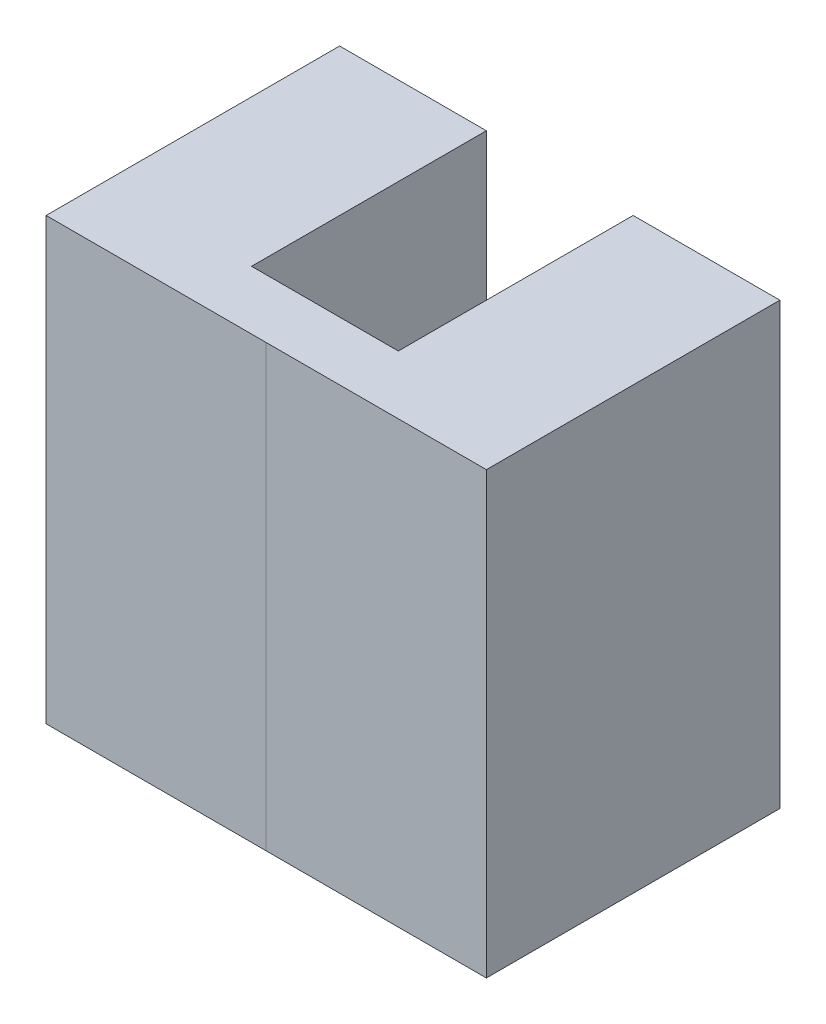
ISO-10303-21;
HEADER;
FILE_DESCRIPTION(('STEP AP214'),'2;1');
FILE_NAME('part.step','',(''),(''),'','','');
FILE_SCHEMA(('AUTOMOTIVE_DESIGN { 1 0 10303 214 1 1 1 1 }'));
ENDSEC;
DATA;
#1=APPLICATION_CONTEXT('core data for automotive mechanical design processes');
#2=APPLICATION_PROTOCOL_DEFINITION('international standard','automotive_design',2000,#1);
#3=PRODUCT_CONTEXT('',#1,'mechanical');
#4=PRODUCT('Part','Part','',(#3));
#5=PRODUCT_RELATED_PRODUCT_CATEGORY('part','',(#4));
#6=PRODUCT_DEFINITION_FORMATION('','',#4);
#7=PRODUCT_DEFINITION_CONTEXT('part definition',#1,'design');
#8=PRODUCT_DEFINITION('design','',#6,#7);
#9=PRODUCT_DEFINITION_SHAPE('','',#8);
#10=(LENGTH_UNIT() NAMED_UNIT(*) SI_UNIT(.MILLI.,.METRE.));
#11=(NAMED_UNIT(*) PLANE_ANGLE_UNIT() SI_UNIT($,.RADIAN.));
#12=(NAMED_UNIT(*) SI_UNIT($,.STERADIAN.) SOLID_ANGLE_UNIT());
#13=UNCERTAINTY_MEASURE_WITH_UNIT(LENGTH_MEASURE(1.E-05),#10,'distance_accuracy_value','');
#14=(GEOMETRIC_REPRESENTATION_CONTEXT(3) GLOBAL_UNCERTAINTY_ASSIGNED_CONTEXT((#13)) GLOBAL_UNIT_ASSIGNED_CONTEXT((#10,
#11,#12)) REPRESENTATION_CONTEXT('',''));
#15=CARTESIAN_POINT('',(0.,0.,0.));
#16=DIRECTION('',(0.,0.,1.));
#17=DIRECTION('',(1.,0.,0.));
#18=AXIS2_PLACEMENT_3D('',#15,#16,#17);
#19=CARTESIAN_POINT('',(0.,0.,2.));
#20=DIRECTION('',(0.,0.,-1.));
#21=DIRECTION('',(-1.,0.,0.));
#22=AXIS2_PLACEMENT_3D('',#19,#20,#21);
#23=PLANE('',#22);
#24=DIRECTION('',(0.,1.,0.));
#25=VECTOR('',#24,1.);
#26=CARTESIAN_POINT('',(1.5,0.,2.));
#27=LINE('',#26,#25);
#28=CARTESIAN_POINT('',(1.5,0.,2.));
#29=VERTEX_POINT('',#28);
#30=CARTESIAN_POINT('',(1.5,3.,2.));
#31=VERTEX_POINT('',#30);
#32=EDGE_CURVE('E11',#29,#31,#27,.T.);
#33=ORIENTED_EDGE('',*,*,#32,.F.);
#34=DIRECTION('',(1.,0.,0.));
#35=VECTOR('',#34,1.);
#36=CARTESIAN_POINT('',(0.,0.,2.));
#37=LINE('',#36,#35);
#38=CARTESIAN_POINT('',(3.,0.,2.));
#39=VERTEX_POINT('',#38);
#40=EDGE_CURVE('E194',#29,#39,#37,.T.);
#41=ORIENTED_EDGE('',*,*,#40,.T.);
#42=DIRECTION('',(0.,1.,0.));
#43=VECTOR('',#42,1.);
#44=CARTESIAN_POINT('',(3.,0.,2.));
#45=LINE('',#44,#43);
#46=CARTESIAN_POINT('',(3.,3.,2.));
#47=VERTEX_POINT('',#46);
#48=EDGE_CURVE('E189',#39,#47,#45,.T.);
#49=ORIENTED_EDGE('',*,*,#48,.T.);
#50=DIRECTION('',(-1.,0.,0.));
#51=VECTOR('',#50,1.);
#52=CARTESIAN_POINT('',(0.,3.,2.));
#53=LINE('',#52,#51);
#54=EDGE_CURVE('E160',#47,#31,#53,.T.);
#55=ORIENTED_EDGE('',*,*,#54,.T.);
#56=EDGE_LOOP('',(#33,#41,#49,#55));
#57=FACE_BOUND('',#56,.T.);
#58=ADVANCED_FACE('F46',(#57),#23,.F.);
#59=CARTESIAN_POINT('',(0.,0.,0.));
#60=DIRECTION('',(0.,0.,-1.));
#61=DIRECTION('',(-1.,0.,0.));
#62=AXIS2_PLACEMENT_3D('',#59,#60,#61);
#63=PLANE('',#62);
#64=DIRECTION('',(0.,-1.,0.));
#65=VECTOR('',#64,1.);
#66=CARTESIAN_POINT('',(1.,3.,0.));
#67=LINE('',#66,#65);
#68=CARTESIAN_POINT('',(1.,3.,0.));
#69=VERTEX_POINT('',#68);
#70=CARTESIAN_POINT('',(1.,0.,0.));
#71=VERTEX_POINT('',#70);
#72=EDGE_CURVE('E115',#69,#71,#67,.T.);
#73=ORIENTED_EDGE('',*,*,#72,.T.);
#74=DIRECTION('',(1.,0.,0.));
#75=VECTOR('',#74,1.);
#76=CARTESIAN_POINT('',(0.,0.,0.));
#77=LINE('',#76,#75);
#78=CARTESIAN_POINT('',(0.,0.,0.));
#79=VERTEX_POINT('',#78);
#80=EDGE_CURVE('E152',#79,#71,#77,.T.);
#81=ORIENTED_EDGE('',*,*,#80,.F.);
#82=DIRECTION('',(0.,-1.,0.));
#83=VECTOR('',#82,1.);
#84=CARTESIAN_POINT('',(0.,0.,0.));
#85=LINE('',#84,#83);
#86=CARTESIAN_POINT('',(0.,3.,0.));
#87=VERTEX_POINT('',#86);
#88=EDGE_CURVE('E143',#87,#79,#85,.T.);
#89=ORIENTED_EDGE('',*,*,#88,.F.);
#90=DIRECTION('',(-1.,0.,0.));
#91=VECTOR('',#90,1.);
#92=CARTESIAN_POINT('',(0.,3.,0.));
#93=LINE('',#92,#91);
#94=EDGE_CURVE('E132',#69,#87,#93,.T.);
#95=ORIENTED_EDGE('',*,*,#94,.F.);
#96=EDGE_LOOP('',(#73,#81,#89,#95));
#97=FACE_BOUND('',#96,.T.);
#98=ADVANCED_FACE('F141',(#97),#63,.T.);
#99=CARTESIAN_POINT('',(0.,0.,2.));
#100=DIRECTION('',(1.,0.,0.));
#101=DIRECTION('',(0.,0.,-1.));
#102=AXIS2_PLACEMENT_3D('',#99,#100,#101);
#103=PLANE('',#102);
#104=ORIENTED_EDGE('',*,*,#88,.T.);
#105=DIRECTION('',(0.,0.,-1.));
#106=VECTOR('',#105,1.);
#107=CARTESIAN_POINT('',(0.,0.,2.));
#108=LINE('',#107,#106);
#109=CARTESIAN_POINT('',(0.,0.,2.));
#110=VERTEX_POINT('',#109);
#111=EDGE_CURVE('E55',#110,#79,#108,.T.);
#112=ORIENTED_EDGE('',*,*,#111,.F.);
#113=DIRECTION('',(0.,-1.,0.));
#114=VECTOR('',#113,1.);
#115=CARTESIAN_POINT('',(0.,0.,2.));
#116=LINE('',#115,#114);
#117=CARTESIAN_POINT('',(0.,3.,2.));
#118=VERTEX_POINT('',#117);
#119=EDGE_CURVE('E151',#118,#110,#116,.T.);
#120=ORIENTED_EDGE('',*,*,#119,.F.);
#121=DIRECTION('',(0.,0.,-1.));
#122=VECTOR('',#121,1.);
#123=CARTESIAN_POINT('',(0.,3.,2.));
#124=LINE('',#123,#122);
#125=EDGE_CURVE('E156',#118,#87,#124,.T.);
#126=ORIENTED_EDGE('',*,*,#125,.T.);
#127=EDGE_LOOP('',(#104,#112,#120,#126));
#128=FACE_BOUND('',#127,.T.);
#129=ADVANCED_FACE('F48',(#128),#103,.F.);
#130=CARTESIAN_POINT('',(0.,0.,2.));
#131=DIRECTION('',(0.,1.,0.));
#132=DIRECTION('',(0.,0.,1.));
#133=AXIS2_PLACEMENT_3D('',#130,#131,#132);
#134=PLANE('',#133);
#135=ORIENTED_EDGE('',*,*,#80,.T.);
#136=DIRECTION('',(0.,0.,-1.));
#137=VECTOR('',#136,1.);
#138=CARTESIAN_POINT('',(1.,0.,0.));
#139=LINE('',#138,#137);
#140=CARTESIAN_POINT('',(1.,0.,1.6));
#141=VERTEX_POINT('',#140);
#142=EDGE_CURVE('E121',#141,#71,#139,.T.);
#143=ORIENTED_EDGE('',*,*,#142,.F.);
#144=DIRECTION('',(-1.,0.,0.));
#145=VECTOR('',#144,1.);
#146=CARTESIAN_POINT('',(1.,0.,1.6));
#147=LINE('',#146,#145);
#148=CARTESIAN_POINT('',(2.,0.,1.6));
#149=VERTEX_POINT('',#148);
#150=EDGE_CURVE('E138',#149,#141,#147,.T.);
#151=ORIENTED_EDGE('',*,*,#150,.F.);
#152=DIRECTION('',(0.,0.,1.));
#153=VECTOR('',#152,1.);
#154=CARTESIAN_POINT('',(2.,0.,0.));
#155=LINE('',#154,#153);
#156=CARTESIAN_POINT('',(2.,0.,0.));
#157=VERTEX_POINT('',#156);
#158=EDGE_CURVE('E204',#157,#149,#155,.T.);
#159=ORIENTED_EDGE('',*,*,#158,.F.);
#160=CARTESIAN_POINT('',(3.,0.,0.));
#161=VERTEX_POINT('',#160);
#162=EDGE_CURVE('E177',#157,#161,#77,.T.);
#163=ORIENTED_EDGE('',*,*,#162,.T.);
#164=DIRECTION('',(0.,0.,-1.));
#165=VECTOR('',#164,1.);
#166=CARTESIAN_POINT('',(3.,0.,2.));
#167=LINE('',#166,#165);
#168=EDGE_CURVE('E164',#39,#161,#167,.T.);
#169=ORIENTED_EDGE('',*,*,#168,.F.);
#170=ORIENTED_EDGE('',*,*,#40,.F.);
#171=EDGE_CURVE('E172',#110,#29,#37,.T.);
#172=ORIENTED_EDGE('',*,*,#171,.F.);
#173=ORIENTED_EDGE('',*,*,#111,.T.);
#174=EDGE_LOOP('',(#135,#143,#151,#159,#163,#169,#170,#172,#173));
#175=FACE_BOUND('',#174,.T.);
#176=ADVANCED_FACE('F171',(#175),#134,.F.);
#177=CARTESIAN_POINT('',(3.,0.,2.));
#178=DIRECTION('',(-1.,0.,0.));
#179=DIRECTION('',(0.,0.,1.));
#180=AXIS2_PLACEMENT_3D('',#177,#178,#179);
#181=PLANE('',#180);
#182=DIRECTION('',(0.,1.,0.));
#183=VECTOR('',#182,1.);
#184=CARTESIAN_POINT('',(3.,0.,0.));
#185=LINE('',#184,#183);
#186=CARTESIAN_POINT('',(3.,3.,0.));
#187=VERTEX_POINT('',#186);
#188=EDGE_CURVE('E146',#161,#187,#185,.T.);
#189=ORIENTED_EDGE('',*,*,#188,.T.);
#190=DIRECTION('',(0.,0.,-1.));
#191=VECTOR('',#190,1.);
#192=CARTESIAN_POINT('',(3.,3.,2.));
#193=LINE('',#192,#191);
#194=EDGE_CURVE('E159',#47,#187,#193,.T.);
#195=ORIENTED_EDGE('',*,*,#194,.F.);
#196=ORIENTED_EDGE('',*,*,#48,.F.);
#197=ORIENTED_EDGE('',*,*,#168,.T.);
#198=EDGE_LOOP('',(#189,#195,#196,#197));
#199=FACE_BOUND('',#198,.T.);
#200=ADVANCED_FACE('F226',(#199),#181,.F.);
#201=CARTESIAN_POINT('',(0.,3.,2.));
#202=DIRECTION('',(0.,-1.,0.));
#203=DIRECTION('',(0.,0.,-1.));
#204=AXIS2_PLACEMENT_3D('',#201,#202,#203);
#205=PLANE('',#204);
#206=DIRECTION('',(-1.,0.,0.));
#207=VECTOR('',#206,1.);
#208=CARTESIAN_POINT('',(1.,3.,1.6));
#209=LINE('',#208,#207);
#210=CARTESIAN_POINT('',(2.,3.,1.6));
#211=VERTEX_POINT('',#210);
#212=CARTESIAN_POINT('',(1.,3.,1.6));
#213=VERTEX_POINT('',#212);
#214=EDGE_CURVE('E127',#211,#213,#209,.T.);
#215=ORIENTED_EDGE('',*,*,#214,.T.);
#216=DIRECTION('',(0.,0.,-1.));
#217=VECTOR('',#216,1.);
#218=CARTESIAN_POINT('',(1.,3.,0.));
#219=LINE('',#218,#217);
#220=EDGE_CURVE('E118',#213,#69,#219,.T.);
#221=ORIENTED_EDGE('',*,*,#220,.T.);
#222=ORIENTED_EDGE('',*,*,#94,.T.);
#223=ORIENTED_EDGE('',*,*,#125,.F.);
#224=EDGE_CURVE('E188',#31,#118,#53,.T.);
#225=ORIENTED_EDGE('',*,*,#224,.F.);
#226=ORIENTED_EDGE('',*,*,#54,.F.);
#227=ORIENTED_EDGE('',*,*,#194,.T.);
#228=CARTESIAN_POINT('',(2.,3.,0.));
#229=VERTEX_POINT('',#228);
#230=EDGE_CURVE('E145',#187,#229,#93,.T.);
#231=ORIENTED_EDGE('',*,*,#230,.T.);
#232=DIRECTION('',(0.,0.,1.));
#233=VECTOR('',#232,1.);
#234=CARTESIAN_POINT('',(2.,3.,0.));
#235=LINE('',#234,#233);
#236=EDGE_CURVE('E137',#229,#211,#235,.T.);
#237=ORIENTED_EDGE('',*,*,#236,.T.);
#238=EDGE_LOOP('',(#215,#221,#222,#223,#225,#226,#227,#231,#237));
#239=FACE_BOUND('',#238,.T.);
#240=ADVANCED_FACE('F130',(#239),#205,.F.);
#241=ORIENTED_EDGE('',*,*,#171,.T.);
#242=ORIENTED_EDGE('',*,*,#32,.T.);
#243=ORIENTED_EDGE('',*,*,#224,.T.);
#244=ORIENTED_EDGE('',*,*,#119,.T.);
#245=EDGE_LOOP('',(#241,#242,#243,#244));
#246=FACE_BOUND('',#245,.T.);
#247=ADVANCED_FACE('F231',(#246),#23,.F.);
#248=DIRECTION('',(0.,-1.,0.));
#249=VECTOR('',#248,1.);
#250=CARTESIAN_POINT('',(2.,3.,0.));
#251=LINE('',#250,#249);
#252=EDGE_CURVE('E126',#229,#157,#251,.T.);
#253=ORIENTED_EDGE('',*,*,#252,.F.);
#254=ORIENTED_EDGE('',*,*,#230,.F.);
#255=ORIENTED_EDGE('',*,*,#188,.F.);
#256=ORIENTED_EDGE('',*,*,#162,.F.);
#257=EDGE_LOOP('',(#253,#254,#255,#256));
#258=FACE_BOUND('',#257,.T.);
#259=ADVANCED_FACE('F220',(#258),#63,.T.);
#260=CARTESIAN_POINT('',(1.,3.,0.));
#261=DIRECTION('',(-1.,0.,0.));
#262=DIRECTION('',(0.,0.,1.));
#263=AXIS2_PLACEMENT_3D('',#260,#261,#262);
#264=PLANE('',#263);
#265=ORIENTED_EDGE('',*,*,#142,.T.);
#266=ORIENTED_EDGE('',*,*,#72,.F.);
#267=ORIENTED_EDGE('',*,*,#220,.F.);
#268=DIRECTION('',(0.,-1.,0.));
#269=VECTOR('',#268,1.);
#270=CARTESIAN_POINT('',(1.,3.,1.6));
#271=LINE('',#270,#269);
#272=EDGE_CURVE('E178',#213,#141,#271,.T.);
#273=ORIENTED_EDGE('',*,*,#272,.T.);
#274=EDGE_LOOP('',(#265,#266,#267,#273));
#275=FACE_BOUND('',#274,.T.);
#276=ADVANCED_FACE('F117',(#275),#264,.F.);
#277=CARTESIAN_POINT('',(1.,3.,1.6));
#278=DIRECTION('',(0.,0.,1.));
#279=DIRECTION('',(1.,0.,0.));
#280=AXIS2_PLACEMENT_3D('',#277,#278,#279);
#281=PLANE('',#280);
#282=ORIENTED_EDGE('',*,*,#150,.T.);
#283=ORIENTED_EDGE('',*,*,#272,.F.);
#284=ORIENTED_EDGE('',*,*,#214,.F.);
#285=DIRECTION('',(0.,-1.,0.));
#286=VECTOR('',#285,1.);
#287=CARTESIAN_POINT('',(2.,3.,1.6));
#288=LINE('',#287,#286);
#289=EDGE_CURVE('E182',#211,#149,#288,.T.);
#290=ORIENTED_EDGE('',*,*,#289,.T.);
#291=EDGE_LOOP('',(#282,#283,#284,#290));
#292=FACE_BOUND('',#291,.T.);
#293=ADVANCED_FACE('F284',(#292),#281,.F.);
#294=CARTESIAN_POINT('',(2.,3.,0.));
#295=DIRECTION('',(1.,0.,0.));
#296=DIRECTION('',(0.,0.,-1.));
#297=AXIS2_PLACEMENT_3D('',#294,#295,#296);
#298=PLANE('',#297);
#299=ORIENTED_EDGE('',*,*,#158,.T.);
#300=ORIENTED_EDGE('',*,*,#289,.F.);
#301=ORIENTED_EDGE('',*,*,#236,.F.);
#302=ORIENTED_EDGE('',*,*,#252,.T.);
#303=EDGE_LOOP('',(#299,#300,#301,#302));
#304=FACE_BOUND('',#303,.T.);
#305=ADVANCED_FACE('F216',(#304),#298,.F.);
#306=CLOSED_SHELL('',(#58,#98,#129,#176,#200,#240,#247,#259,#276,#293,#305));
#307=MANIFOLD_SOLID_BREP('B2',#306);
#308=ADVANCED_BREP_SHAPE_REPRESENTATION('',(#18,#307),#14);
#309=SHAPE_DEFINITION_REPRESENTATION(#9,#308);
ENDSEC;
END-ISO-10303-21;
